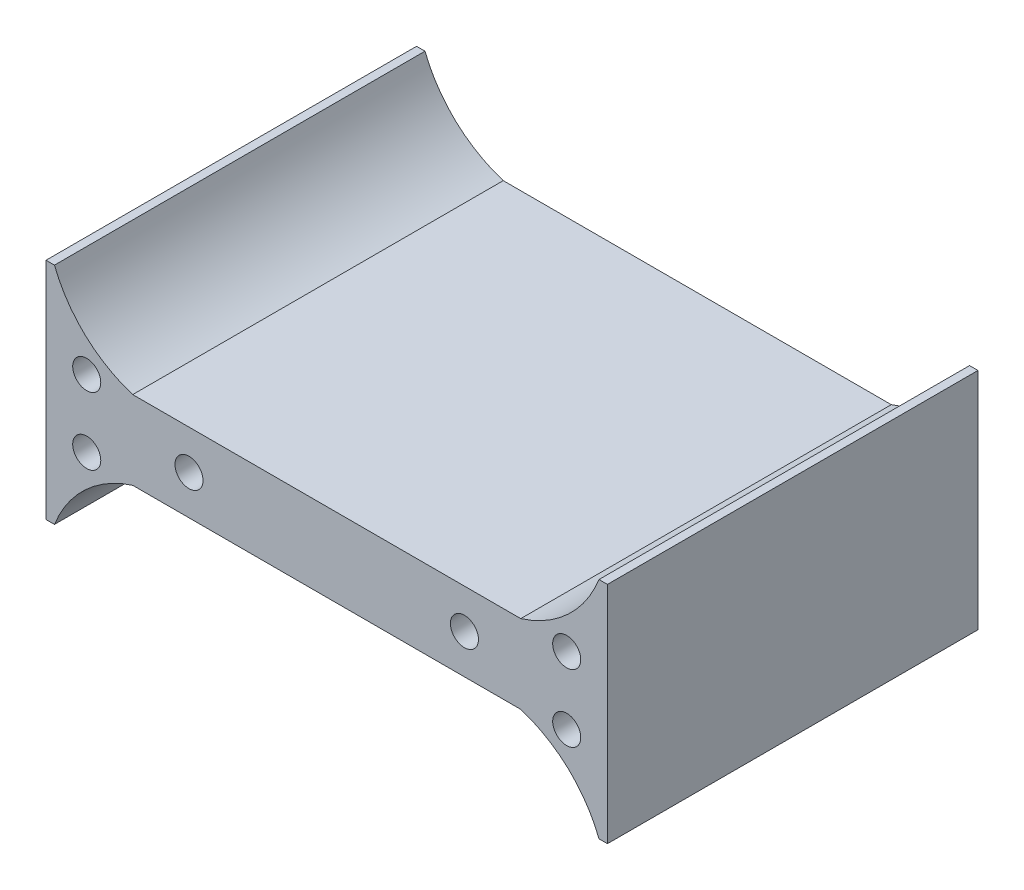
ISO-10303-21;
HEADER;
FILE_DESCRIPTION(('STEP AP214'),'2;1');
FILE_NAME('part.step','',(''),(''),'','','');
FILE_SCHEMA(('AUTOMOTIVE_DESIGN { 1 0 10303 214 1 1 1 1 }'));
ENDSEC;
DATA;
#1=APPLICATION_CONTEXT('core data for automotive mechanical design processes');
#2=APPLICATION_PROTOCOL_DEFINITION('international standard','automotive_design',2000,#1);
#3=PRODUCT_CONTEXT('',#1,'mechanical');
#4=PRODUCT('Part','Part','',(#3));
#5=PRODUCT_RELATED_PRODUCT_CATEGORY('part','',(#4));
#6=PRODUCT_DEFINITION_FORMATION('','',#4);
#7=PRODUCT_DEFINITION_CONTEXT('part definition',#1,'design');
#8=PRODUCT_DEFINITION('design','',#6,#7);
#9=PRODUCT_DEFINITION_SHAPE('','',#8);
#10=(LENGTH_UNIT() NAMED_UNIT(*) SI_UNIT(.MILLI.,.METRE.));
#11=(NAMED_UNIT(*) PLANE_ANGLE_UNIT() SI_UNIT($,.RADIAN.));
#12=(NAMED_UNIT(*) SI_UNIT($,.STERADIAN.) SOLID_ANGLE_UNIT());
#13=UNCERTAINTY_MEASURE_WITH_UNIT(LENGTH_MEASURE(1.E-05),#10,'distance_accuracy_value','');
#14=(GEOMETRIC_REPRESENTATION_CONTEXT(3) GLOBAL_UNCERTAINTY_ASSIGNED_CONTEXT((#13)) GLOBAL_UNIT_ASSIGNED_CONTEXT((#10,
#11,#12)) REPRESENTATION_CONTEXT('',''));
#15=CARTESIAN_POINT('',(0.,0.,0.));
#16=DIRECTION('',(0.,0.,1.));
#17=DIRECTION('',(1.,0.,0.));
#18=AXIS2_PLACEMENT_3D('',#15,#16,#17);
#19=CARTESIAN_POINT('',(0.,28.5,33.));
#20=DIRECTION('',(0.,-1.,0.));
#21=DIRECTION('',(0.,0.,-1.));
#22=AXIS2_PLACEMENT_3D('',#19,#20,#21);
#23=PLANE('',#22);
#24=DIRECTION('',(-1.,0.,0.));
#25=VECTOR('',#24,1.);
#26=CARTESIAN_POINT('',(0.,28.5,33.));
#27=LINE('',#26,#25);
#28=CARTESIAN_POINT('',(42.278719262151,28.5,33.));
#29=VERTEX_POINT('',#28);
#30=CARTESIAN_POINT('',(7.72128073784901,28.5,33.));
#31=VERTEX_POINT('',#30);
#32=EDGE_CURVE('E160',#29,#31,#27,.T.);
#33=ORIENTED_EDGE('',*,*,#32,.F.);
#34=DIRECTION('',(0.,0.,-1.));
#35=VECTOR('',#34,1.);
#36=CARTESIAN_POINT('',(42.278719262151,28.5,33.));
#37=LINE('',#36,#35);
#38=CARTESIAN_POINT('',(42.278719262151,28.5,0.));
#39=VERTEX_POINT('',#38);
#40=EDGE_CURVE('E213',#29,#39,#37,.T.);
#41=ORIENTED_EDGE('',*,*,#40,.T.);
#42=DIRECTION('',(-1.,0.,0.));
#43=VECTOR('',#42,1.);
#44=CARTESIAN_POINT('',(0.,28.5,0.));
#45=LINE('',#44,#43);
#46=CARTESIAN_POINT('',(7.72128073784901,28.5,0.));
#47=VERTEX_POINT('',#46);
#48=EDGE_CURVE('E150',#39,#47,#45,.T.);
#49=ORIENTED_EDGE('',*,*,#48,.T.);
#50=DIRECTION('',(0.,0.,-1.));
#51=VECTOR('',#50,1.);
#52=CARTESIAN_POINT('',(7.72128073784901,28.5,33.));
#53=LINE('',#52,#51);
#54=EDGE_CURVE('E206',#31,#47,#53,.T.);
#55=ORIENTED_EDGE('',*,*,#54,.F.);
#56=EDGE_LOOP('',(#33,#41,#49,#55));
#57=FACE_BOUND('',#56,.T.);
#58=ADVANCED_FACE('F36',(#57),#23,.F.);
#59=CARTESIAN_POINT('',(0.,28.5,33.));
#60=DIRECTION('',(1.,0.,0.));
#61=DIRECTION('',(0.,0.,-1.));
#62=AXIS2_PLACEMENT_3D('',#59,#60,#61);
#63=PLANE('',#62);
#64=DIRECTION('',(0.,-1.,0.));
#65=VECTOR('',#64,1.);
#66=CARTESIAN_POINT('',(0.,28.5,33.));
#67=LINE('',#66,#65);
#68=CARTESIAN_POINT('',(0.,35.,33.));
#69=VERTEX_POINT('',#68);
#70=CARTESIAN_POINT('',(0.,15.,33.));
#71=VERTEX_POINT('',#70);
#72=EDGE_CURVE('E154',#69,#71,#67,.T.);
#73=ORIENTED_EDGE('',*,*,#72,.F.);
#74=DIRECTION('',(0.,0.,-1.));
#75=VECTOR('',#74,1.);
#76=CARTESIAN_POINT('',(0.,35.,40.));
#77=LINE('',#76,#75);
#78=CARTESIAN_POINT('',(0.,35.,0.));
#79=VERTEX_POINT('',#78);
#80=EDGE_CURVE('E134',#69,#79,#77,.T.);
#81=ORIENTED_EDGE('',*,*,#80,.T.);
#82=DIRECTION('',(0.,-1.,0.));
#83=VECTOR('',#82,1.);
#84=CARTESIAN_POINT('',(0.,28.5,0.));
#85=LINE('',#84,#83);
#86=CARTESIAN_POINT('',(0.,15.,0.));
#87=VERTEX_POINT('',#86);
#88=EDGE_CURVE('E157',#79,#87,#85,.T.);
#89=ORIENTED_EDGE('',*,*,#88,.T.);
#90=DIRECTION('',(0.,0.,-1.));
#91=VECTOR('',#90,1.);
#92=CARTESIAN_POINT('',(0.,15.,40.));
#93=LINE('',#92,#91);
#94=EDGE_CURVE('E265',#71,#87,#93,.T.);
#95=ORIENTED_EDGE('',*,*,#94,.F.);
#96=EDGE_LOOP('',(#73,#81,#89,#95));
#97=FACE_BOUND('',#96,.T.);
#98=ADVANCED_FACE('F38',(#97),#63,.F.);
#99=CARTESIAN_POINT('',(0.,21.5,33.));
#100=DIRECTION('',(0.,1.,0.));
#101=DIRECTION('',(0.,0.,1.));
#102=AXIS2_PLACEMENT_3D('',#99,#100,#101);
#103=PLANE('',#102);
#104=DIRECTION('',(1.,0.,0.));
#105=VECTOR('',#104,1.);
#106=CARTESIAN_POINT('',(0.,21.5,0.));
#107=LINE('',#106,#105);
#108=CARTESIAN_POINT('',(7.72128073784901,21.5,0.));
#109=VERTEX_POINT('',#108);
#110=CARTESIAN_POINT('',(42.278719262151,21.5,0.));
#111=VERTEX_POINT('',#110);
#112=EDGE_CURVE('E151',#109,#111,#107,.T.);
#113=ORIENTED_EDGE('',*,*,#112,.T.);
#114=DIRECTION('',(0.,0.,-1.));
#115=VECTOR('',#114,1.);
#116=CARTESIAN_POINT('',(42.278719262151,21.5,33.));
#117=LINE('',#116,#115);
#118=CARTESIAN_POINT('',(42.278719262151,21.5,33.));
#119=VERTEX_POINT('',#118);
#120=EDGE_CURVE('E198',#119,#111,#117,.T.);
#121=ORIENTED_EDGE('',*,*,#120,.F.);
#122=DIRECTION('',(1.,0.,0.));
#123=VECTOR('',#122,1.);
#124=CARTESIAN_POINT('',(0.,21.5,33.));
#125=LINE('',#124,#123);
#126=CARTESIAN_POINT('',(7.72128073784901,21.5,33.));
#127=VERTEX_POINT('',#126);
#128=EDGE_CURVE('E168',#127,#119,#125,.T.);
#129=ORIENTED_EDGE('',*,*,#128,.F.);
#130=DIRECTION('',(0.,0.,-1.));
#131=VECTOR('',#130,1.);
#132=CARTESIAN_POINT('',(7.72128073784901,21.5,33.));
#133=LINE('',#132,#131);
#134=EDGE_CURVE('E172',#127,#109,#133,.T.);
#135=ORIENTED_EDGE('',*,*,#134,.T.);
#136=EDGE_LOOP('',(#113,#121,#129,#135));
#137=FACE_BOUND('',#136,.T.);
#138=ADVANCED_FACE('F196',(#137),#103,.F.);
#139=CARTESIAN_POINT('',(50.,28.5,33.));
#140=DIRECTION('',(-1.,0.,0.));
#141=DIRECTION('',(0.,0.,1.));
#142=AXIS2_PLACEMENT_3D('',#139,#140,#141);
#143=PLANE('',#142);
#144=DIRECTION('',(0.,1.,0.));
#145=VECTOR('',#144,1.);
#146=CARTESIAN_POINT('',(50.,28.5,0.));
#147=LINE('',#146,#145);
#148=CARTESIAN_POINT('',(50.,15.,0.));
#149=VERTEX_POINT('',#148);
#150=CARTESIAN_POINT('',(50.,35.,0.));
#151=VERTEX_POINT('',#150);
#152=EDGE_CURVE('E142',#149,#151,#147,.T.);
#153=ORIENTED_EDGE('',*,*,#152,.T.);
#154=DIRECTION('',(0.,0.,-1.));
#155=VECTOR('',#154,1.);
#156=CARTESIAN_POINT('',(50.,35.,40.));
#157=LINE('',#156,#155);
#158=CARTESIAN_POINT('',(50.,35.,33.));
#159=VERTEX_POINT('',#158);
#160=EDGE_CURVE('E123',#159,#151,#157,.T.);
#161=ORIENTED_EDGE('',*,*,#160,.F.);
#162=DIRECTION('',(0.,1.,0.));
#163=VECTOR('',#162,1.);
#164=CARTESIAN_POINT('',(50.,28.5,33.));
#165=LINE('',#164,#163);
#166=CARTESIAN_POINT('',(50.,15.,33.));
#167=VERTEX_POINT('',#166);
#168=EDGE_CURVE('E162',#167,#159,#165,.T.);
#169=ORIENTED_EDGE('',*,*,#168,.F.);
#170=DIRECTION('',(0.,0.,-1.));
#171=VECTOR('',#170,1.);
#172=CARTESIAN_POINT('',(50.,15.,40.));
#173=LINE('',#172,#171);
#174=EDGE_CURVE('E149',#167,#149,#173,.T.);
#175=ORIENTED_EDGE('',*,*,#174,.T.);
#176=EDGE_LOOP('',(#153,#161,#169,#175));
#177=FACE_BOUND('',#176,.T.);
#178=ADVANCED_FACE('F148',(#177),#143,.F.);
#179=CARTESIAN_POINT('',(0.,0.,33.));
#180=DIRECTION('',(0.,0.,1.));
#181=DIRECTION('',(1.,0.,0.));
#182=AXIS2_PLACEMENT_3D('',#179,#180,#181);
#183=PLANE('',#182);
#184=CARTESIAN_POINT('',(3.62748332736771,22.,33.));
#185=DIRECTION('',(0.,0.,1.));
#186=DIRECTION('',(1.,0.,0.));
#187=AXIS2_PLACEMENT_3D('',#184,#185,#186);
#188=CIRCLE('',#187,1.25);
#189=CARTESIAN_POINT('',(4.87748332736771,22.,33.));
#190=VERTEX_POINT('',#189);
#191=EDGE_CURVE('E297',#190,#190,#188,.T.);
#192=ORIENTED_EDGE('',*,*,#191,.F.);
#193=EDGE_LOOP('',(#192));
#194=FACE_BOUND('',#193,.T.);
#195=CARTESIAN_POINT('',(12.7354869288775,25.,33.));
#196=DIRECTION('',(0.,0.,1.));
#197=DIRECTION('',(1.,0.,0.));
#198=AXIS2_PLACEMENT_3D('',#195,#196,#197);
#199=CIRCLE('',#198,1.25);
#200=CARTESIAN_POINT('',(13.9854869288775,25.,33.));
#201=VERTEX_POINT('',#200);
#202=EDGE_CURVE('E291',#201,#201,#199,.T.);
#203=ORIENTED_EDGE('',*,*,#202,.F.);
#204=EDGE_LOOP('',(#203));
#205=FACE_BOUND('',#204,.T.);
#206=CARTESIAN_POINT('',(46.3725166726323,22.,33.));
#207=DIRECTION('',(0.,0.,1.));
#208=DIRECTION('',(1.,0.,0.));
#209=AXIS2_PLACEMENT_3D('',#206,#207,#208);
#210=CIRCLE('',#209,1.25);
#211=CARTESIAN_POINT('',(47.6225166726323,22.,33.));
#212=VERTEX_POINT('',#211);
#213=EDGE_CURVE('E285',#212,#212,#210,.T.);
#214=ORIENTED_EDGE('',*,*,#213,.F.);
#215=EDGE_LOOP('',(#214));
#216=FACE_BOUND('',#215,.T.);
#217=CARTESIAN_POINT('',(46.3725166726323,28.,33.));
#218=DIRECTION('',(0.,0.,1.));
#219=DIRECTION('',(1.,0.,0.));
#220=AXIS2_PLACEMENT_3D('',#217,#218,#219);
#221=CIRCLE('',#220,1.25);
#222=CARTESIAN_POINT('',(47.6225166726323,28.,33.));
#223=VERTEX_POINT('',#222);
#224=EDGE_CURVE('E278',#223,#223,#221,.T.);
#225=ORIENTED_EDGE('',*,*,#224,.F.);
#226=EDGE_LOOP('',(#225));
#227=FACE_BOUND('',#226,.T.);
#228=CARTESIAN_POINT('',(37.2645130711225,25.,33.));
#229=DIRECTION('',(0.,0.,1.));
#230=DIRECTION('',(1.,0.,0.));
#231=AXIS2_PLACEMENT_3D('',#228,#229,#230);
#232=CIRCLE('',#231,1.25);
#233=CARTESIAN_POINT('',(38.5145130711225,25.,33.));
#234=VERTEX_POINT('',#233);
#235=EDGE_CURVE('E302',#234,#234,#232,.T.);
#236=ORIENTED_EDGE('',*,*,#235,.F.);
#237=EDGE_LOOP('',(#236));
#238=FACE_BOUND('',#237,.T.);
#239=CARTESIAN_POINT('',(3.62748332736771,28.,33.));
#240=DIRECTION('',(0.,0.,1.));
#241=DIRECTION('',(1.,0.,0.));
#242=AXIS2_PLACEMENT_3D('',#239,#240,#241);
#243=CIRCLE('',#242,1.25);
#244=CARTESIAN_POINT('',(4.87748332736771,28.,33.));
#245=VERTEX_POINT('',#244);
#246=EDGE_CURVE('E271',#245,#245,#243,.T.);
#247=ORIENTED_EDGE('',*,*,#246,.F.);
#248=EDGE_LOOP('',(#247));
#249=FACE_BOUND('',#248,.T.);
#250=DIRECTION('',(1.,0.,0.));
#251=VECTOR('',#250,1.);
#252=CARTESIAN_POINT('',(0.,35.,33.));
#253=LINE('',#252,#251);
#254=CARTESIAN_POINT('',(0.7530492340404,35.,33.));
#255=VERTEX_POINT('',#254);
#256=EDGE_CURVE('E261',#69,#255,#253,.T.);
#257=ORIENTED_EDGE('',*,*,#256,.F.);
#258=ORIENTED_EDGE('',*,*,#72,.T.);
#259=DIRECTION('',(-1.,0.,0.));
#260=VECTOR('',#259,1.);
#261=CARTESIAN_POINT('',(0.,15.,33.));
#262=LINE('',#261,#260);
#263=CARTESIAN_POINT('',(0.753049234040404,15.,33.));
#264=VERTEX_POINT('',#263);
#265=EDGE_CURVE('E255',#264,#71,#262,.T.);
#266=ORIENTED_EDGE('',*,*,#265,.F.);
#267=CARTESIAN_POINT('',(11.,11.,33.));
#268=DIRECTION('',(0.,0.,1.));
#269=DIRECTION('',(-1.,0.,0.));
#270=AXIS2_PLACEMENT_3D('',#267,#268,#269);
#271=CIRCLE('',#270,11.);
#272=EDGE_CURVE('E177',#127,#264,#271,.T.);
#273=ORIENTED_EDGE('',*,*,#272,.F.);
#274=ORIENTED_EDGE('',*,*,#128,.T.);
#275=CARTESIAN_POINT('',(39.,11.,33.));
#276=DIRECTION('',(0.,0.,1.));
#277=DIRECTION('',(-1.,0.,0.));
#278=AXIS2_PLACEMENT_3D('',#275,#276,#277);
#279=CIRCLE('',#278,11.);
#280=CARTESIAN_POINT('',(49.2469507659596,15.,33.));
#281=VERTEX_POINT('',#280);
#282=EDGE_CURVE('E193',#281,#119,#279,.T.);
#283=ORIENTED_EDGE('',*,*,#282,.F.);
#284=EDGE_CURVE('E58',#167,#281,#262,.T.);
#285=ORIENTED_EDGE('',*,*,#284,.F.);
#286=ORIENTED_EDGE('',*,*,#168,.T.);
#287=CARTESIAN_POINT('',(49.2469507659596,35.,33.));
#288=VERTEX_POINT('',#287);
#289=EDGE_CURVE('E129',#288,#159,#253,.T.);
#290=ORIENTED_EDGE('',*,*,#289,.F.);
#291=CARTESIAN_POINT('',(39.,39.,33.));
#292=DIRECTION('',(0.,0.,1.));
#293=DIRECTION('',(1.,0.,0.));
#294=AXIS2_PLACEMENT_3D('',#291,#292,#293);
#295=CIRCLE('',#294,11.);
#296=EDGE_CURVE('E217',#29,#288,#295,.T.);
#297=ORIENTED_EDGE('',*,*,#296,.F.);
#298=ORIENTED_EDGE('',*,*,#32,.T.);
#299=CARTESIAN_POINT('',(11.,39.,33.));
#300=DIRECTION('',(0.,0.,1.));
#301=DIRECTION('',(1.,0.,0.));
#302=AXIS2_PLACEMENT_3D('',#299,#300,#301);
#303=CIRCLE('',#302,11.);
#304=EDGE_CURVE('E210',#255,#31,#303,.T.);
#305=ORIENTED_EDGE('',*,*,#304,.F.);
#306=EDGE_LOOP('',(#257,#258,#266,#273,#274,#283,#285,#286,#290,#297,#298,#305));
#307=FACE_BOUND('',#306,.T.);
#308=ADVANCED_FACE('F192',(#194,#205,#216,#227,#238,#249,#307),#183,.T.);
#309=CARTESIAN_POINT('',(0.,0.,0.));
#310=DIRECTION('',(0.,0.,1.));
#311=DIRECTION('',(1.,0.,0.));
#312=AXIS2_PLACEMENT_3D('',#309,#310,#311);
#313=PLANE('',#312);
#314=CARTESIAN_POINT('',(46.3725166726323,22.,0.));
#315=DIRECTION('',(0.,0.,-1.));
#316=DIRECTION('',(-1.,0.,0.));
#317=AXIS2_PLACEMENT_3D('',#314,#315,#316);
#318=CIRCLE('',#317,1.25);
#319=CARTESIAN_POINT('',(45.1225166726323,22.,0.));
#320=VERTEX_POINT('',#319);
#321=EDGE_CURVE('E247',#320,#320,#318,.T.);
#322=ORIENTED_EDGE('',*,*,#321,.F.);
#323=EDGE_LOOP('',(#322));
#324=FACE_BOUND('',#323,.T.);
#325=CARTESIAN_POINT('',(37.2645130711225,25.,0.));
#326=DIRECTION('',(0.,0.,-1.));
#327=DIRECTION('',(-1.,0.,0.));
#328=AXIS2_PLACEMENT_3D('',#325,#326,#327);
#329=CIRCLE('',#328,1.25);
#330=CARTESIAN_POINT('',(36.0145130711225,25.,0.));
#331=VERTEX_POINT('',#330);
#332=EDGE_CURVE('E241',#331,#331,#329,.T.);
#333=ORIENTED_EDGE('',*,*,#332,.F.);
#334=EDGE_LOOP('',(#333));
#335=FACE_BOUND('',#334,.T.);
#336=CARTESIAN_POINT('',(3.62748332736771,22.,0.));
#337=DIRECTION('',(0.,0.,-1.));
#338=DIRECTION('',(1.,0.,0.));
#339=AXIS2_PLACEMENT_3D('',#336,#337,#338);
#340=CIRCLE('',#339,1.25);
#341=CARTESIAN_POINT('',(4.87748332736771,22.,0.));
#342=VERTEX_POINT('',#341);
#343=EDGE_CURVE('E235',#342,#342,#340,.T.);
#344=ORIENTED_EDGE('',*,*,#343,.F.);
#345=EDGE_LOOP('',(#344));
#346=FACE_BOUND('',#345,.T.);
#347=CARTESIAN_POINT('',(3.62748332736771,28.,0.));
#348=DIRECTION('',(0.,0.,-1.));
#349=DIRECTION('',(1.,0.,0.));
#350=AXIS2_PLACEMENT_3D('',#347,#348,#349);
#351=CIRCLE('',#350,1.25);
#352=CARTESIAN_POINT('',(4.87748332736771,28.,0.));
#353=VERTEX_POINT('',#352);
#354=EDGE_CURVE('E228',#353,#353,#351,.T.);
#355=ORIENTED_EDGE('',*,*,#354,.F.);
#356=EDGE_LOOP('',(#355));
#357=FACE_BOUND('',#356,.T.);
#358=CARTESIAN_POINT('',(12.7354869288775,25.,0.));
#359=DIRECTION('',(0.,0.,-1.));
#360=DIRECTION('',(1.,0.,0.));
#361=AXIS2_PLACEMENT_3D('',#358,#359,#360);
#362=CIRCLE('',#361,1.25);
#363=CARTESIAN_POINT('',(13.9854869288775,25.,0.));
#364=VERTEX_POINT('',#363);
#365=EDGE_CURVE('E252',#364,#364,#362,.T.);
#366=ORIENTED_EDGE('',*,*,#365,.F.);
#367=EDGE_LOOP('',(#366));
#368=FACE_BOUND('',#367,.T.);
#369=CARTESIAN_POINT('',(46.3725166726323,28.,0.));
#370=DIRECTION('',(0.,0.,-1.));
#371=DIRECTION('',(-1.,0.,0.));
#372=AXIS2_PLACEMENT_3D('',#369,#370,#371);
#373=CIRCLE('',#372,1.25);
#374=CARTESIAN_POINT('',(45.1225166726323,28.,0.));
#375=VERTEX_POINT('',#374);
#376=EDGE_CURVE('E222',#375,#375,#373,.T.);
#377=ORIENTED_EDGE('',*,*,#376,.F.);
#378=EDGE_LOOP('',(#377));
#379=FACE_BOUND('',#378,.T.);
#380=ORIENTED_EDGE('',*,*,#88,.F.);
#381=DIRECTION('',(-1.,0.,0.));
#382=VECTOR('',#381,1.);
#383=CARTESIAN_POINT('',(50.,35.,0.));
#384=LINE('',#383,#382);
#385=CARTESIAN_POINT('',(0.7530492340404,35.,0.));
#386=VERTEX_POINT('',#385);
#387=EDGE_CURVE('E145',#386,#79,#384,.T.);
#388=ORIENTED_EDGE('',*,*,#387,.F.);
#389=CARTESIAN_POINT('',(11.,39.,0.));
#390=DIRECTION('',(0.,0.,1.));
#391=DIRECTION('',(1.,0.,0.));
#392=AXIS2_PLACEMENT_3D('',#389,#390,#391);
#393=CIRCLE('',#392,11.);
#394=EDGE_CURVE('E211',#386,#47,#393,.T.);
#395=ORIENTED_EDGE('',*,*,#394,.T.);
#396=ORIENTED_EDGE('',*,*,#48,.F.);
#397=CARTESIAN_POINT('',(39.,39.,0.));
#398=DIRECTION('',(0.,0.,1.));
#399=DIRECTION('',(1.,0.,0.));
#400=AXIS2_PLACEMENT_3D('',#397,#398,#399);
#401=CIRCLE('',#400,11.);
#402=CARTESIAN_POINT('',(49.2469507659596,35.,0.));
#403=VERTEX_POINT('',#402);
#404=EDGE_CURVE('E144',#39,#403,#401,.T.);
#405=ORIENTED_EDGE('',*,*,#404,.T.);
#406=EDGE_CURVE('E126',#151,#403,#384,.T.);
#407=ORIENTED_EDGE('',*,*,#406,.F.);
#408=ORIENTED_EDGE('',*,*,#152,.F.);
#409=DIRECTION('',(1.,0.,0.));
#410=VECTOR('',#409,1.);
#411=CARTESIAN_POINT('',(50.,15.,0.));
#412=LINE('',#411,#410);
#413=CARTESIAN_POINT('',(49.2469507659596,15.,0.));
#414=VERTEX_POINT('',#413);
#415=EDGE_CURVE('E268',#414,#149,#412,.T.);
#416=ORIENTED_EDGE('',*,*,#415,.F.);
#417=CARTESIAN_POINT('',(39.,11.,0.));
#418=DIRECTION('',(0.,0.,1.));
#419=DIRECTION('',(-1.,0.,0.));
#420=AXIS2_PLACEMENT_3D('',#417,#418,#419);
#421=CIRCLE('',#420,11.);
#422=EDGE_CURVE('E203',#414,#111,#421,.T.);
#423=ORIENTED_EDGE('',*,*,#422,.T.);
#424=ORIENTED_EDGE('',*,*,#112,.F.);
#425=CARTESIAN_POINT('',(11.,11.,0.));
#426=DIRECTION('',(0.,0.,1.));
#427=DIRECTION('',(-1.,0.,0.));
#428=AXIS2_PLACEMENT_3D('',#425,#426,#427);
#429=CIRCLE('',#428,11.);
#430=CARTESIAN_POINT('',(0.753049234040404,15.,0.));
#431=VERTEX_POINT('',#430);
#432=EDGE_CURVE('E183',#109,#431,#429,.T.);
#433=ORIENTED_EDGE('',*,*,#432,.T.);
#434=EDGE_CURVE('E51',#87,#431,#412,.T.);
#435=ORIENTED_EDGE('',*,*,#434,.F.);
#436=EDGE_LOOP('',(#380,#388,#395,#396,#405,#407,#408,#416,#423,#424,#433,#435));
#437=FACE_BOUND('',#436,.T.);
#438=ADVANCED_FACE('F140',(#324,#335,#346,#357,#368,#379,#437),#313,.F.);
#439=CARTESIAN_POINT('',(11.,11.,33.));
#440=DIRECTION('',(0.,0.,-1.));
#441=DIRECTION('',(-1.,0.,0.));
#442=AXIS2_PLACEMENT_3D('',#439,#440,#441);
#443=CYLINDRICAL_SURFACE('',#442,11.);
#444=DIRECTION('',(0.,0.,-1.));
#445=VECTOR('',#444,1.);
#446=CARTESIAN_POINT('',(0.753049234040404,15.,33.));
#447=LINE('',#446,#445);
#448=EDGE_CURVE('E258',#431,#264,#447,.F.);
#449=ORIENTED_EDGE('',*,*,#448,.F.);
#450=ORIENTED_EDGE('',*,*,#432,.F.);
#451=ORIENTED_EDGE('',*,*,#134,.F.);
#452=ORIENTED_EDGE('',*,*,#272,.T.);
#453=EDGE_LOOP('',(#449,#450,#451,#452));
#454=FACE_BOUND('',#453,.T.);
#455=ADVANCED_FACE('F368',(#454),#443,.F.);
#456=CARTESIAN_POINT('',(39.,11.,33.));
#457=DIRECTION('',(0.,0.,-1.));
#458=DIRECTION('',(-1.,0.,0.));
#459=AXIS2_PLACEMENT_3D('',#456,#457,#458);
#460=CYLINDRICAL_SURFACE('',#459,11.);
#461=DIRECTION('',(0.,0.,-1.));
#462=VECTOR('',#461,1.);
#463=CARTESIAN_POINT('',(49.2469507659596,15.,33.));
#464=LINE('',#463,#462);
#465=EDGE_CURVE('E11',#281,#414,#464,.T.);
#466=ORIENTED_EDGE('',*,*,#465,.F.);
#467=ORIENTED_EDGE('',*,*,#282,.T.);
#468=ORIENTED_EDGE('',*,*,#120,.T.);
#469=ORIENTED_EDGE('',*,*,#422,.F.);
#470=EDGE_LOOP('',(#466,#467,#468,#469));
#471=FACE_BOUND('',#470,.T.);
#472=ADVANCED_FACE('F375',(#471),#460,.F.);
#473=CARTESIAN_POINT('',(11.,39.,33.));
#474=DIRECTION('',(0.,0.,-1.));
#475=DIRECTION('',(-1.,0.,0.));
#476=AXIS2_PLACEMENT_3D('',#473,#474,#475);
#477=CYLINDRICAL_SURFACE('',#476,11.);
#478=DIRECTION('',(0.,0.,-1.));
#479=VECTOR('',#478,1.);
#480=CARTESIAN_POINT('',(0.7530492340404,35.,33.));
#481=LINE('',#480,#479);
#482=EDGE_CURVE('E262',#255,#386,#481,.T.);
#483=ORIENTED_EDGE('',*,*,#482,.F.);
#484=ORIENTED_EDGE('',*,*,#304,.T.);
#485=ORIENTED_EDGE('',*,*,#54,.T.);
#486=ORIENTED_EDGE('',*,*,#394,.F.);
#487=EDGE_LOOP('',(#483,#484,#485,#486));
#488=FACE_BOUND('',#487,.T.);
#489=ADVANCED_FACE('F383',(#488),#477,.F.);
#490=CARTESIAN_POINT('',(39.,39.,33.));
#491=DIRECTION('',(0.,0.,-1.));
#492=DIRECTION('',(-1.,0.,0.));
#493=AXIS2_PLACEMENT_3D('',#490,#491,#492);
#494=CYLINDRICAL_SURFACE('',#493,11.);
#495=DIRECTION('',(0.,0.,-1.));
#496=VECTOR('',#495,1.);
#497=CARTESIAN_POINT('',(49.2469507659596,35.,33.));
#498=LINE('',#497,#496);
#499=EDGE_CURVE('E44',#403,#288,#498,.F.);
#500=ORIENTED_EDGE('',*,*,#499,.F.);
#501=ORIENTED_EDGE('',*,*,#404,.F.);
#502=ORIENTED_EDGE('',*,*,#40,.F.);
#503=ORIENTED_EDGE('',*,*,#296,.T.);
#504=EDGE_LOOP('',(#500,#501,#502,#503));
#505=FACE_BOUND('',#504,.T.);
#506=ADVANCED_FACE('F390',(#505),#494,.F.);
#507=CARTESIAN_POINT('',(46.3725166726323,28.,8.));
#508=DIRECTION('',(0.,0.,-1.));
#509=DIRECTION('',(-1.,0.,0.));
#510=AXIS2_PLACEMENT_3D('',#507,#508,#509);
#511=CYLINDRICAL_SURFACE('',#510,1.25);
#512=CARTESIAN_POINT('',(46.3725166726323,28.,8.));
#513=DIRECTION('',(0.,0.,-1.));
#514=DIRECTION('',(-1.,0.,0.));
#515=AXIS2_PLACEMENT_3D('',#512,#513,#514);
#516=CIRCLE('',#515,1.25);
#517=CARTESIAN_POINT('',(45.1225166726323,28.,8.));
#518=VERTEX_POINT('',#517);
#519=EDGE_CURVE('E219',#518,#518,#516,.T.);
#520=ORIENTED_EDGE('',*,*,#519,.F.);
#521=EDGE_LOOP('',(#520));
#522=FACE_BOUND('',#521,.T.);
#523=ORIENTED_EDGE('',*,*,#376,.T.);
#524=EDGE_LOOP('',(#523));
#525=FACE_BOUND('',#524,.T.);
#526=ADVANCED_FACE('F398',(#522,#525),#511,.F.);
#527=CARTESIAN_POINT('',(46.3725166726323,28.,8.));
#528=DIRECTION('',(0.,0.,-1.));
#529=DIRECTION('',(-1.,0.,0.));
#530=AXIS2_PLACEMENT_3D('',#527,#528,#529);
#531=PLANE('',#530);
#532=ORIENTED_EDGE('',*,*,#519,.T.);
#533=EDGE_LOOP('',(#532));
#534=FACE_BOUND('',#533,.T.);
#535=ADVANCED_FACE('F406',(#534),#531,.T.);
#536=CARTESIAN_POINT('',(12.7354869288775,25.,8.));
#537=DIRECTION('',(0.,0.,-1.));
#538=DIRECTION('',(-1.,0.,0.));
#539=AXIS2_PLACEMENT_3D('',#536,#537,#538);
#540=CYLINDRICAL_SURFACE('',#539,1.25);
#541=CARTESIAN_POINT('',(12.7354869288775,25.,8.));
#542=DIRECTION('',(0.,0.,-1.));
#543=DIRECTION('',(1.,0.,0.));
#544=AXIS2_PLACEMENT_3D('',#541,#542,#543);
#545=CIRCLE('',#544,1.25);
#546=CARTESIAN_POINT('',(13.9854869288775,25.,8.));
#547=VERTEX_POINT('',#546);
#548=EDGE_CURVE('E232',#547,#547,#545,.T.);
#549=ORIENTED_EDGE('',*,*,#548,.F.);
#550=EDGE_LOOP('',(#549));
#551=FACE_BOUND('',#550,.T.);
#552=ORIENTED_EDGE('',*,*,#365,.T.);
#553=EDGE_LOOP('',(#552));
#554=FACE_BOUND('',#553,.T.);
#555=ADVANCED_FACE('F414',(#551,#554),#540,.F.);
#556=CARTESIAN_POINT('',(12.7354869288775,25.,8.));
#557=DIRECTION('',(0.,0.,1.));
#558=DIRECTION('',(1.,0.,0.));
#559=AXIS2_PLACEMENT_3D('',#556,#557,#558);
#560=PLANE('',#559);
#561=ORIENTED_EDGE('',*,*,#548,.T.);
#562=EDGE_LOOP('',(#561));
#563=FACE_BOUND('',#562,.T.);
#564=ADVANCED_FACE('F422',(#563),#560,.F.);
#565=CARTESIAN_POINT('',(3.62748332736771,28.,8.));
#566=DIRECTION('',(0.,0.,-1.));
#567=DIRECTION('',(-1.,0.,0.));
#568=AXIS2_PLACEMENT_3D('',#565,#566,#567);
#569=CYLINDRICAL_SURFACE('',#568,1.25);
#570=CARTESIAN_POINT('',(3.62748332736771,28.,8.));
#571=DIRECTION('',(0.,0.,-1.));
#572=DIRECTION('',(1.,0.,0.));
#573=AXIS2_PLACEMENT_3D('',#570,#571,#572);
#574=CIRCLE('',#573,1.25);
#575=CARTESIAN_POINT('',(4.87748332736771,28.,8.));
#576=VERTEX_POINT('',#575);
#577=EDGE_CURVE('E231',#576,#576,#574,.T.);
#578=ORIENTED_EDGE('',*,*,#577,.F.);
#579=EDGE_LOOP('',(#578));
#580=FACE_BOUND('',#579,.T.);
#581=ORIENTED_EDGE('',*,*,#354,.T.);
#582=EDGE_LOOP('',(#581));
#583=FACE_BOUND('',#582,.T.);
#584=ADVANCED_FACE('F430',(#580,#583),#569,.F.);
#585=CARTESIAN_POINT('',(3.62748332736771,28.,8.));
#586=DIRECTION('',(0.,0.,1.));
#587=DIRECTION('',(1.,0.,0.));
#588=AXIS2_PLACEMENT_3D('',#585,#586,#587);
#589=PLANE('',#588);
#590=ORIENTED_EDGE('',*,*,#577,.T.);
#591=EDGE_LOOP('',(#590));
#592=FACE_BOUND('',#591,.T.);
#593=ADVANCED_FACE('F438',(#592),#589,.F.);
#594=CARTESIAN_POINT('',(3.62748332736771,22.,8.));
#595=DIRECTION('',(0.,0.,-1.));
#596=DIRECTION('',(-1.,0.,0.));
#597=AXIS2_PLACEMENT_3D('',#594,#595,#596);
#598=CYLINDRICAL_SURFACE('',#597,1.25);
#599=CARTESIAN_POINT('',(3.62748332736771,22.,8.));
#600=DIRECTION('',(0.,0.,-1.));
#601=DIRECTION('',(1.,0.,0.));
#602=AXIS2_PLACEMENT_3D('',#599,#600,#601);
#603=CIRCLE('',#602,1.25);
#604=CARTESIAN_POINT('',(4.87748332736771,22.,8.));
#605=VERTEX_POINT('',#604);
#606=EDGE_CURVE('E238',#605,#605,#603,.T.);
#607=ORIENTED_EDGE('',*,*,#606,.F.);
#608=EDGE_LOOP('',(#607));
#609=FACE_BOUND('',#608,.T.);
#610=ORIENTED_EDGE('',*,*,#343,.T.);
#611=EDGE_LOOP('',(#610));
#612=FACE_BOUND('',#611,.T.);
#613=ADVANCED_FACE('F446',(#609,#612),#598,.F.);
#614=CARTESIAN_POINT('',(3.62748332736771,22.,8.));
#615=DIRECTION('',(0.,0.,1.));
#616=DIRECTION('',(1.,0.,0.));
#617=AXIS2_PLACEMENT_3D('',#614,#615,#616);
#618=PLANE('',#617);
#619=ORIENTED_EDGE('',*,*,#606,.T.);
#620=EDGE_LOOP('',(#619));
#621=FACE_BOUND('',#620,.T.);
#622=ADVANCED_FACE('F454',(#621),#618,.F.);
#623=CARTESIAN_POINT('',(37.2645130711225,25.,8.));
#624=DIRECTION('',(0.,0.,-1.));
#625=DIRECTION('',(-1.,0.,0.));
#626=AXIS2_PLACEMENT_3D('',#623,#624,#625);
#627=CYLINDRICAL_SURFACE('',#626,1.25);
#628=CARTESIAN_POINT('',(37.2645130711225,25.,8.));
#629=DIRECTION('',(0.,0.,-1.));
#630=DIRECTION('',(-1.,0.,0.));
#631=AXIS2_PLACEMENT_3D('',#628,#629,#630);
#632=CIRCLE('',#631,1.25);
#633=CARTESIAN_POINT('',(36.0145130711225,25.,8.));
#634=VERTEX_POINT('',#633);
#635=EDGE_CURVE('E244',#634,#634,#632,.T.);
#636=ORIENTED_EDGE('',*,*,#635,.F.);
#637=EDGE_LOOP('',(#636));
#638=FACE_BOUND('',#637,.T.);
#639=ORIENTED_EDGE('',*,*,#332,.T.);
#640=EDGE_LOOP('',(#639));
#641=FACE_BOUND('',#640,.T.);
#642=ADVANCED_FACE('F462',(#638,#641),#627,.F.);
#643=CARTESIAN_POINT('',(37.2645130711225,25.,8.));
#644=DIRECTION('',(0.,0.,-1.));
#645=DIRECTION('',(-1.,0.,0.));
#646=AXIS2_PLACEMENT_3D('',#643,#644,#645);
#647=PLANE('',#646);
#648=ORIENTED_EDGE('',*,*,#635,.T.);
#649=EDGE_LOOP('',(#648));
#650=FACE_BOUND('',#649,.T.);
#651=ADVANCED_FACE('F470',(#650),#647,.T.);
#652=CARTESIAN_POINT('',(46.3725166726323,22.,8.));
#653=DIRECTION('',(0.,0.,-1.));
#654=DIRECTION('',(-1.,0.,0.));
#655=AXIS2_PLACEMENT_3D('',#652,#653,#654);
#656=CYLINDRICAL_SURFACE('',#655,1.25);
#657=CARTESIAN_POINT('',(46.3725166726323,22.,8.));
#658=DIRECTION('',(0.,0.,-1.));
#659=DIRECTION('',(-1.,0.,0.));
#660=AXIS2_PLACEMENT_3D('',#657,#658,#659);
#661=CIRCLE('',#660,1.25);
#662=CARTESIAN_POINT('',(45.1225166726323,22.,8.));
#663=VERTEX_POINT('',#662);
#664=EDGE_CURVE('E225',#663,#663,#661,.T.);
#665=ORIENTED_EDGE('',*,*,#664,.F.);
#666=EDGE_LOOP('',(#665));
#667=FACE_BOUND('',#666,.T.);
#668=ORIENTED_EDGE('',*,*,#321,.T.);
#669=EDGE_LOOP('',(#668));
#670=FACE_BOUND('',#669,.T.);
#671=ADVANCED_FACE('F478',(#667,#670),#656,.F.);
#672=CARTESIAN_POINT('',(46.3725166726323,22.,8.));
#673=DIRECTION('',(0.,0.,-1.));
#674=DIRECTION('',(-1.,0.,0.));
#675=AXIS2_PLACEMENT_3D('',#672,#673,#674);
#676=PLANE('',#675);
#677=ORIENTED_EDGE('',*,*,#664,.T.);
#678=EDGE_LOOP('',(#677));
#679=FACE_BOUND('',#678,.T.);
#680=ADVANCED_FACE('F486',(#679),#676,.T.);
#681=CARTESIAN_POINT('',(50.,35.,40.));
#682=DIRECTION('',(0.,-1.,0.));
#683=DIRECTION('',(0.,0.,-1.));
#684=AXIS2_PLACEMENT_3D('',#681,#682,#683);
#685=PLANE('',#684);
#686=ORIENTED_EDGE('',*,*,#289,.T.);
#687=ORIENTED_EDGE('',*,*,#160,.T.);
#688=ORIENTED_EDGE('',*,*,#406,.T.);
#689=ORIENTED_EDGE('',*,*,#499,.T.);
#690=EDGE_LOOP('',(#686,#687,#688,#689));
#691=FACE_BOUND('',#690,.T.);
#692=ADVANCED_FACE('F125',(#691),#685,.F.);
#693=ORIENTED_EDGE('',*,*,#256,.T.);
#694=ORIENTED_EDGE('',*,*,#482,.T.);
#695=ORIENTED_EDGE('',*,*,#387,.T.);
#696=ORIENTED_EDGE('',*,*,#80,.F.);
#697=EDGE_LOOP('',(#693,#694,#695,#696));
#698=FACE_BOUND('',#697,.T.);
#699=ADVANCED_FACE('F500',(#698),#685,.F.);
#700=CARTESIAN_POINT('',(50.,15.,40.));
#701=DIRECTION('',(0.,1.,0.));
#702=DIRECTION('',(0.,0.,1.));
#703=AXIS2_PLACEMENT_3D('',#700,#701,#702);
#704=PLANE('',#703);
#705=ORIENTED_EDGE('',*,*,#284,.T.);
#706=ORIENTED_EDGE('',*,*,#465,.T.);
#707=ORIENTED_EDGE('',*,*,#415,.T.);
#708=ORIENTED_EDGE('',*,*,#174,.F.);
#709=EDGE_LOOP('',(#705,#706,#707,#708));
#710=FACE_BOUND('',#709,.T.);
#711=ADVANCED_FACE('F334',(#710),#704,.F.);
#712=ORIENTED_EDGE('',*,*,#265,.T.);
#713=ORIENTED_EDGE('',*,*,#94,.T.);
#714=ORIENTED_EDGE('',*,*,#434,.T.);
#715=ORIENTED_EDGE('',*,*,#448,.T.);
#716=EDGE_LOOP('',(#712,#713,#714,#715));
#717=FACE_BOUND('',#716,.T.);
#718=ADVANCED_FACE('F325',(#717),#704,.F.);
#719=CARTESIAN_POINT('',(3.62748332736771,28.,25.));
#720=DIRECTION('',(0.,0.,1.));
#721=DIRECTION('',(1.,0.,0.));
#722=AXIS2_PLACEMENT_3D('',#719,#720,#721);
#723=CYLINDRICAL_SURFACE('',#722,1.25);
#724=CARTESIAN_POINT('',(3.62748332736771,28.,25.));
#725=DIRECTION('',(0.,0.,1.));
#726=DIRECTION('',(1.,0.,0.));
#727=AXIS2_PLACEMENT_3D('',#724,#725,#726);
#728=CIRCLE('',#727,1.25);
#729=CARTESIAN_POINT('',(4.87748332736771,28.,25.));
#730=VERTEX_POINT('',#729);
#731=EDGE_CURVE('E274',#730,#730,#728,.T.);
#732=ORIENTED_EDGE('',*,*,#731,.F.);
#733=EDGE_LOOP('',(#732));
#734=FACE_BOUND('',#733,.T.);
#735=ORIENTED_EDGE('',*,*,#246,.T.);
#736=EDGE_LOOP('',(#735));
#737=FACE_BOUND('',#736,.T.);
#738=ADVANCED_FACE('F323',(#734,#737),#723,.F.);
#739=CARTESIAN_POINT('',(3.62748332736771,28.,25.));
#740=DIRECTION('',(0.,0.,1.));
#741=DIRECTION('',(1.,0.,0.));
#742=AXIS2_PLACEMENT_3D('',#739,#740,#741);
#743=PLANE('',#742);
#744=ORIENTED_EDGE('',*,*,#731,.T.);
#745=EDGE_LOOP('',(#744));
#746=FACE_BOUND('',#745,.T.);
#747=ADVANCED_FACE('F313',(#746),#743,.T.);
#748=CARTESIAN_POINT('',(37.2645130711225,25.,25.));
#749=DIRECTION('',(0.,0.,1.));
#750=DIRECTION('',(1.,0.,0.));
#751=AXIS2_PLACEMENT_3D('',#748,#749,#750);
#752=CYLINDRICAL_SURFACE('',#751,1.25);
#753=CARTESIAN_POINT('',(37.2645130711225,25.,25.));
#754=DIRECTION('',(0.,0.,1.));
#755=DIRECTION('',(1.,0.,0.));
#756=AXIS2_PLACEMENT_3D('',#753,#754,#755);
#757=CIRCLE('',#756,1.25);
#758=CARTESIAN_POINT('',(38.5145130711225,25.,25.));
#759=VERTEX_POINT('',#758);
#760=EDGE_CURVE('E282',#759,#759,#757,.T.);
#761=ORIENTED_EDGE('',*,*,#760,.F.);
#762=EDGE_LOOP('',(#761));
#763=FACE_BOUND('',#762,.T.);
#764=ORIENTED_EDGE('',*,*,#235,.T.);
#765=EDGE_LOOP('',(#764));
#766=FACE_BOUND('',#765,.T.);
#767=ADVANCED_FACE('F310',(#763,#766),#752,.F.);
#768=CARTESIAN_POINT('',(37.2645130711225,25.,25.));
#769=DIRECTION('',(0.,0.,1.));
#770=DIRECTION('',(1.,0.,0.));
#771=AXIS2_PLACEMENT_3D('',#768,#769,#770);
#772=PLANE('',#771);
#773=ORIENTED_EDGE('',*,*,#760,.T.);
#774=EDGE_LOOP('',(#773));
#775=FACE_BOUND('',#774,.T.);
#776=ADVANCED_FACE('F308',(#775),#772,.T.);
#777=CARTESIAN_POINT('',(46.3725166726323,28.,25.));
#778=DIRECTION('',(0.,0.,1.));
#779=DIRECTION('',(1.,0.,0.));
#780=AXIS2_PLACEMENT_3D('',#777,#778,#779);
#781=CYLINDRICAL_SURFACE('',#780,1.25);
#782=CARTESIAN_POINT('',(46.3725166726323,28.,25.));
#783=DIRECTION('',(0.,0.,1.));
#784=DIRECTION('',(1.,0.,0.));
#785=AXIS2_PLACEMENT_3D('',#782,#783,#784);
#786=CIRCLE('',#785,1.25);
#787=CARTESIAN_POINT('',(47.6225166726323,28.,25.));
#788=VERTEX_POINT('',#787);
#789=EDGE_CURVE('E281',#788,#788,#786,.T.);
#790=ORIENTED_EDGE('',*,*,#789,.F.);
#791=EDGE_LOOP('',(#790));
#792=FACE_BOUND('',#791,.T.);
#793=ORIENTED_EDGE('',*,*,#224,.T.);
#794=EDGE_LOOP('',(#793));
#795=FACE_BOUND('',#794,.T.);
#796=ADVANCED_FACE('F540',(#792,#795),#781,.F.);
#797=CARTESIAN_POINT('',(46.3725166726323,28.,25.));
#798=DIRECTION('',(0.,0.,1.));
#799=DIRECTION('',(1.,0.,0.));
#800=AXIS2_PLACEMENT_3D('',#797,#798,#799);
#801=PLANE('',#800);
#802=ORIENTED_EDGE('',*,*,#789,.T.);
#803=EDGE_LOOP('',(#802));
#804=FACE_BOUND('',#803,.T.);
#805=ADVANCED_FACE('F548',(#804),#801,.T.);
#806=CARTESIAN_POINT('',(46.3725166726323,22.,25.));
#807=DIRECTION('',(0.,0.,1.));
#808=DIRECTION('',(1.,0.,0.));
#809=AXIS2_PLACEMENT_3D('',#806,#807,#808);
#810=CYLINDRICAL_SURFACE('',#809,1.25);
#811=CARTESIAN_POINT('',(46.3725166726323,22.,25.));
#812=DIRECTION('',(0.,0.,1.));
#813=DIRECTION('',(1.,0.,0.));
#814=AXIS2_PLACEMENT_3D('',#811,#812,#813);
#815=CIRCLE('',#814,1.25);
#816=CARTESIAN_POINT('',(47.6225166726323,22.,25.));
#817=VERTEX_POINT('',#816);
#818=EDGE_CURVE('E288',#817,#817,#815,.T.);
#819=ORIENTED_EDGE('',*,*,#818,.F.);
#820=EDGE_LOOP('',(#819));
#821=FACE_BOUND('',#820,.T.);
#822=ORIENTED_EDGE('',*,*,#213,.T.);
#823=EDGE_LOOP('',(#822));
#824=FACE_BOUND('',#823,.T.);
#825=ADVANCED_FACE('F557',(#821,#824),#810,.F.);
#826=CARTESIAN_POINT('',(46.3725166726323,22.,25.));
#827=DIRECTION('',(0.,0.,1.));
#828=DIRECTION('',(1.,0.,0.));
#829=AXIS2_PLACEMENT_3D('',#826,#827,#828);
#830=PLANE('',#829);
#831=ORIENTED_EDGE('',*,*,#818,.T.);
#832=EDGE_LOOP('',(#831));
#833=FACE_BOUND('',#832,.T.);
#834=ADVANCED_FACE('F566',(#833),#830,.T.);
#835=CARTESIAN_POINT('',(12.7354869288775,25.,25.));
#836=DIRECTION('',(0.,0.,1.));
#837=DIRECTION('',(1.,0.,0.));
#838=AXIS2_PLACEMENT_3D('',#835,#836,#837);
#839=CYLINDRICAL_SURFACE('',#838,1.25);
#840=CARTESIAN_POINT('',(12.7354869288775,25.,25.));
#841=DIRECTION('',(0.,0.,1.));
#842=DIRECTION('',(1.,0.,0.));
#843=AXIS2_PLACEMENT_3D('',#840,#841,#842);
#844=CIRCLE('',#843,1.25);
#845=CARTESIAN_POINT('',(13.9854869288775,25.,25.));
#846=VERTEX_POINT('',#845);
#847=EDGE_CURVE('E294',#846,#846,#844,.T.);
#848=ORIENTED_EDGE('',*,*,#847,.F.);
#849=EDGE_LOOP('',(#848));
#850=FACE_BOUND('',#849,.T.);
#851=ORIENTED_EDGE('',*,*,#202,.T.);
#852=EDGE_LOOP('',(#851));
#853=FACE_BOUND('',#852,.T.);
#854=ADVANCED_FACE('F575',(#850,#853),#839,.F.);
#855=CARTESIAN_POINT('',(12.7354869288775,25.,25.));
#856=DIRECTION('',(0.,0.,1.));
#857=DIRECTION('',(1.,0.,0.));
#858=AXIS2_PLACEMENT_3D('',#855,#856,#857);
#859=PLANE('',#858);
#860=ORIENTED_EDGE('',*,*,#847,.T.);
#861=EDGE_LOOP('',(#860));
#862=FACE_BOUND('',#861,.T.);
#863=ADVANCED_FACE('F584',(#862),#859,.T.);
#864=CARTESIAN_POINT('',(3.62748332736771,22.,25.));
#865=DIRECTION('',(0.,0.,1.));
#866=DIRECTION('',(1.,0.,0.));
#867=AXIS2_PLACEMENT_3D('',#864,#865,#866);
#868=CYLINDRICAL_SURFACE('',#867,1.25);
#869=CARTESIAN_POINT('',(3.62748332736771,22.,25.));
#870=DIRECTION('',(0.,0.,1.));
#871=DIRECTION('',(1.,0.,0.));
#872=AXIS2_PLACEMENT_3D('',#869,#870,#871);
#873=CIRCLE('',#872,1.25);
#874=CARTESIAN_POINT('',(4.87748332736771,22.,25.));
#875=VERTEX_POINT('',#874);
#876=EDGE_CURVE('E275',#875,#875,#873,.T.);
#877=ORIENTED_EDGE('',*,*,#876,.F.);
#878=EDGE_LOOP('',(#877));
#879=FACE_BOUND('',#878,.T.);
#880=ORIENTED_EDGE('',*,*,#191,.T.);
#881=EDGE_LOOP('',(#880));
#882=FACE_BOUND('',#881,.T.);
#883=ADVANCED_FACE('F593',(#879,#882),#868,.F.);
#884=CARTESIAN_POINT('',(3.62748332736771,22.,25.));
#885=DIRECTION('',(0.,0.,1.));
#886=DIRECTION('',(1.,0.,0.));
#887=AXIS2_PLACEMENT_3D('',#884,#885,#886);
#888=PLANE('',#887);
#889=ORIENTED_EDGE('',*,*,#876,.T.);
#890=EDGE_LOOP('',(#889));
#891=FACE_BOUND('',#890,.T.);
#892=ADVANCED_FACE('F602',(#891),#888,.T.);
#893=CLOSED_SHELL('',(#58,#98,#138,#178,#308,#438,#455,#472,#489,#506,#526,#535,#555,#564,#584,
#593,#613,#622,#642,#651,#671,#680,#692,#699,#711,#718,#738,#747,#767,#776,#796,#805,#825,#834,
#854,#863,#883,#892));
#894=MANIFOLD_SOLID_BREP('B2',#893);
#895=ADVANCED_BREP_SHAPE_REPRESENTATION('',(#18,#894),#14);
#896=SHAPE_DEFINITION_REPRESENTATION(#9,#895);
ENDSEC;
END-ISO-10303-21;
